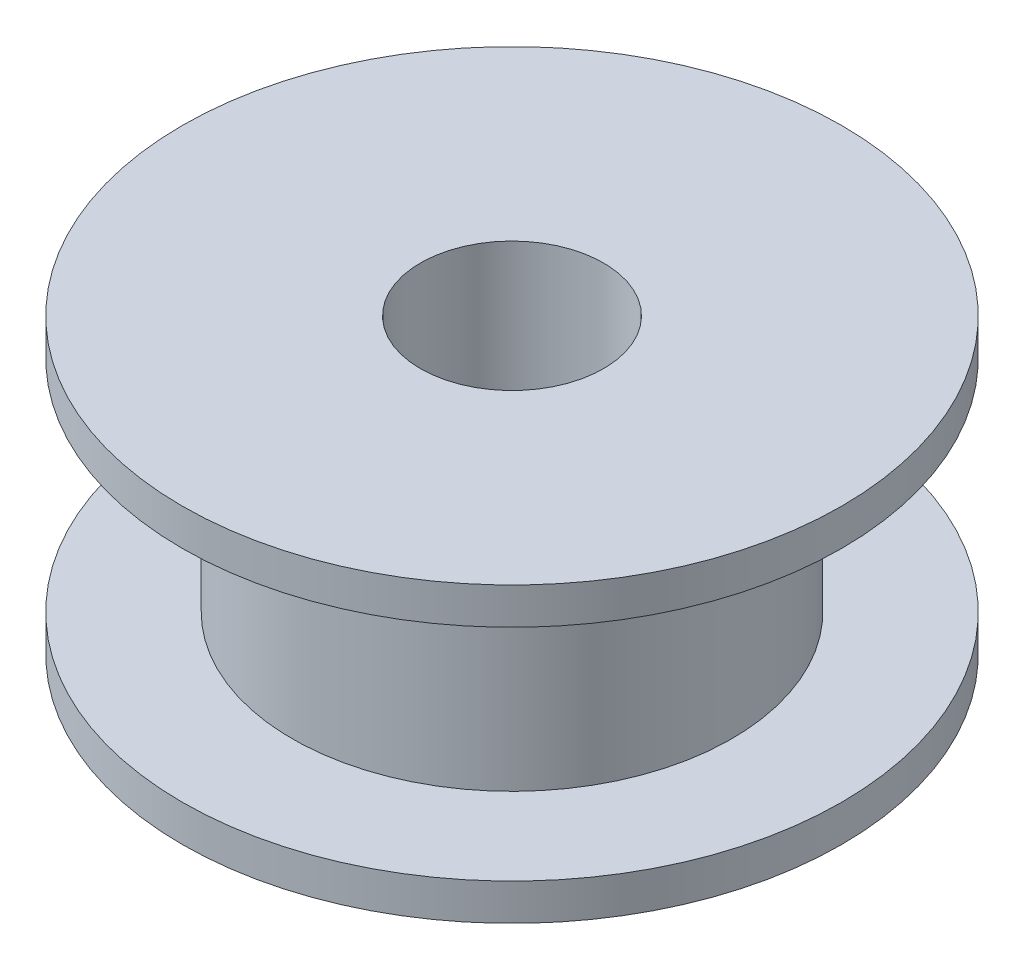
ISO-10303-21;
HEADER;
FILE_DESCRIPTION(('STEP AP214'),'2;1');
FILE_NAME('part.step','',(''),(''),'','','');
FILE_SCHEMA(('AUTOMOTIVE_DESIGN { 1 0 10303 214 1 1 1 1 }'));
ENDSEC;
DATA;
#1=APPLICATION_CONTEXT('core data for automotive mechanical design processes');
#2=APPLICATION_PROTOCOL_DEFINITION('international standard','automotive_design',2000,#1);
#3=PRODUCT_CONTEXT('',#1,'mechanical');
#4=PRODUCT('Part','Part','',(#3));
#5=PRODUCT_RELATED_PRODUCT_CATEGORY('part','',(#4));
#6=PRODUCT_DEFINITION_FORMATION('','',#4);
#7=PRODUCT_DEFINITION_CONTEXT('part definition',#1,'design');
#8=PRODUCT_DEFINITION('design','',#6,#7);
#9=PRODUCT_DEFINITION_SHAPE('','',#8);
#10=(LENGTH_UNIT() NAMED_UNIT(*) SI_UNIT(.MILLI.,.METRE.));
#11=(NAMED_UNIT(*) PLANE_ANGLE_UNIT() SI_UNIT($,.RADIAN.));
#12=(NAMED_UNIT(*) SI_UNIT($,.STERADIAN.) SOLID_ANGLE_UNIT());
#13=UNCERTAINTY_MEASURE_WITH_UNIT(LENGTH_MEASURE(1.E-05),#10,'distance_accuracy_value','');
#14=(GEOMETRIC_REPRESENTATION_CONTEXT(3) GLOBAL_UNCERTAINTY_ASSIGNED_CONTEXT((#13)) GLOBAL_UNIT_ASSIGNED_CONTEXT((#10,
#11,#12)) REPRESENTATION_CONTEXT('',''));
#15=CARTESIAN_POINT('',(0.,0.,0.));
#16=DIRECTION('',(0.,0.,1.));
#17=DIRECTION('',(1.,0.,0.));
#18=AXIS2_PLACEMENT_3D('',#15,#16,#17);
#19=CARTESIAN_POINT('',(0.,8.,0.));
#20=DIRECTION('',(0.,-1.,0.));
#21=DIRECTION('',(0.,0.,-1.));
#22=AXIS2_PLACEMENT_3D('',#19,#20,#21);
#23=CYLINDRICAL_SURFACE('',#22,9.);
#24=CARTESIAN_POINT('',(0.,0.,0.));
#25=DIRECTION('',(0.,1.,0.));
#26=DIRECTION('',(0.,0.,1.));
#27=AXIS2_PLACEMENT_3D('',#24,#25,#26);
#28=CIRCLE('',#27,9.);
#29=CARTESIAN_POINT('',(0.,0.,9.));
#30=VERTEX_POINT('',#29);
#31=EDGE_CURVE('E34',#30,#30,#28,.T.);
#32=ORIENTED_EDGE('',*,*,#31,.T.);
#33=EDGE_LOOP('',(#32));
#34=FACE_BOUND('',#33,.T.);
#35=CARTESIAN_POINT('',(0.,1.,0.));
#36=DIRECTION('',(0.,-1.,0.));
#37=DIRECTION('',(0.,0.,-1.));
#38=AXIS2_PLACEMENT_3D('',#35,#36,#37);
#39=CIRCLE('',#38,9.);
#40=CARTESIAN_POINT('',(0.,1.,-9.));
#41=VERTEX_POINT('',#40);
#42=EDGE_CURVE('E46',#41,#41,#39,.T.);
#43=ORIENTED_EDGE('',*,*,#42,.T.);
#44=EDGE_LOOP('',(#43));
#45=FACE_BOUND('',#44,.T.);
#46=ADVANCED_FACE('F31',(#34,#45),#23,.T.);
#47=CARTESIAN_POINT('',(0.,8.,0.));
#48=DIRECTION('',(0.,1.,0.));
#49=DIRECTION('',(0.,0.,1.));
#50=AXIS2_PLACEMENT_3D('',#47,#48,#49);
#51=CIRCLE('',#50,9.);
#52=CARTESIAN_POINT('',(0.,8.,9.));
#53=VERTEX_POINT('',#52);
#54=EDGE_CURVE('E10',#53,#53,#51,.T.);
#55=ORIENTED_EDGE('',*,*,#54,.F.);
#56=EDGE_LOOP('',(#55));
#57=FACE_BOUND('',#56,.T.);
#58=CARTESIAN_POINT('',(0.,7.,0.));
#59=DIRECTION('',(0.,-1.,0.));
#60=DIRECTION('',(0.,0.,-1.));
#61=AXIS2_PLACEMENT_3D('',#58,#59,#60);
#62=CIRCLE('',#61,9.);
#63=CARTESIAN_POINT('',(0.,7.,-9.));
#64=VERTEX_POINT('',#63);
#65=EDGE_CURVE('E57',#64,#64,#62,.T.);
#66=ORIENTED_EDGE('',*,*,#65,.F.);
#67=EDGE_LOOP('',(#66));
#68=FACE_BOUND('',#67,.T.);
#69=ADVANCED_FACE('F64',(#57,#68),#23,.T.);
#70=CARTESIAN_POINT('',(0.,8.,0.));
#71=DIRECTION('',(0.,1.,0.));
#72=DIRECTION('',(0.,0.,1.));
#73=AXIS2_PLACEMENT_3D('',#70,#71,#72);
#74=PLANE('',#73);
#75=CARTESIAN_POINT('',(0.,8.,0.));
#76=DIRECTION('',(0.,1.,0.));
#77=DIRECTION('',(0.,0.,1.));
#78=AXIS2_PLACEMENT_3D('',#75,#76,#77);
#79=CIRCLE('',#78,2.5);
#80=CARTESIAN_POINT('',(0.,8.,2.5));
#81=VERTEX_POINT('',#80);
#82=EDGE_CURVE('E43',#81,#81,#79,.T.);
#83=ORIENTED_EDGE('',*,*,#82,.F.);
#84=EDGE_LOOP('',(#83));
#85=FACE_BOUND('',#84,.T.);
#86=ORIENTED_EDGE('',*,*,#54,.T.);
#87=EDGE_LOOP('',(#86));
#88=FACE_BOUND('',#87,.T.);
#89=ADVANCED_FACE('F66',(#85,#88),#74,.T.);
#90=CARTESIAN_POINT('',(0.,0.,0.));
#91=DIRECTION('',(0.,1.,0.));
#92=DIRECTION('',(0.,0.,1.));
#93=AXIS2_PLACEMENT_3D('',#90,#91,#92);
#94=PLANE('',#93);
#95=CARTESIAN_POINT('',(0.,0.,0.));
#96=DIRECTION('',(0.,1.,0.));
#97=DIRECTION('',(0.,0.,1.));
#98=AXIS2_PLACEMENT_3D('',#95,#96,#97);
#99=CIRCLE('',#98,2.5);
#100=CARTESIAN_POINT('',(0.,0.,2.5));
#101=VERTEX_POINT('',#100);
#102=EDGE_CURVE('E41',#101,#101,#99,.T.);
#103=ORIENTED_EDGE('',*,*,#102,.T.);
#104=EDGE_LOOP('',(#103));
#105=FACE_BOUND('',#104,.T.);
#106=ORIENTED_EDGE('',*,*,#31,.F.);
#107=EDGE_LOOP('',(#106));
#108=FACE_BOUND('',#107,.T.);
#109=ADVANCED_FACE('F72',(#105,#108),#94,.F.);
#110=CARTESIAN_POINT('',(0.,0.,0.));
#111=DIRECTION('',(0.,1.,0.));
#112=DIRECTION('',(0.,0.,1.));
#113=AXIS2_PLACEMENT_3D('',#110,#111,#112);
#114=CYLINDRICAL_SURFACE('',#113,2.5);
#115=ORIENTED_EDGE('',*,*,#102,.F.);
#116=EDGE_LOOP('',(#115));
#117=FACE_BOUND('',#116,.T.);
#118=ORIENTED_EDGE('',*,*,#82,.T.);
#119=EDGE_LOOP('',(#118));
#120=FACE_BOUND('',#119,.T.);
#121=ADVANCED_FACE('F85',(#117,#120),#114,.F.);
#122=CARTESIAN_POINT('',(0.,1.,9.));
#123=DIRECTION('',(0.,1.,0.));
#124=DIRECTION('',(0.,0.,1.));
#125=AXIS2_PLACEMENT_3D('',#122,#123,#124);
#126=PLANE('',#125);
#127=CARTESIAN_POINT('',(0.,1.,0.));
#128=DIRECTION('',(0.,-1.,0.));
#129=DIRECTION('',(0.,0.,-1.));
#130=AXIS2_PLACEMENT_3D('',#127,#128,#129);
#131=CIRCLE('',#130,6.);
#132=CARTESIAN_POINT('',(0.,1.,-6.));
#133=VERTEX_POINT('',#132);
#134=EDGE_CURVE('E51',#133,#133,#131,.T.);
#135=ORIENTED_EDGE('',*,*,#134,.T.);
#136=EDGE_LOOP('',(#135));
#137=FACE_BOUND('',#136,.T.);
#138=ORIENTED_EDGE('',*,*,#42,.F.);
#139=EDGE_LOOP('',(#138));
#140=FACE_BOUND('',#139,.T.);
#141=ADVANCED_FACE('F82',(#137,#140),#126,.T.);
#142=CARTESIAN_POINT('',(0.,0.,0.));
#143=DIRECTION('',(0.,-1.,0.));
#144=DIRECTION('',(0.,0.,-1.));
#145=AXIS2_PLACEMENT_3D('',#142,#143,#144);
#146=CYLINDRICAL_SURFACE('',#145,6.);
#147=CARTESIAN_POINT('',(0.,7.,0.));
#148=DIRECTION('',(0.,-1.,0.));
#149=DIRECTION('',(0.,0.,-1.));
#150=AXIS2_PLACEMENT_3D('',#147,#148,#149);
#151=CIRCLE('',#150,6.);
#152=CARTESIAN_POINT('',(0.,7.,-6.));
#153=VERTEX_POINT('',#152);
#154=EDGE_CURVE('E54',#153,#153,#151,.T.);
#155=ORIENTED_EDGE('',*,*,#154,.T.);
#156=EDGE_LOOP('',(#155));
#157=FACE_BOUND('',#156,.T.);
#158=ORIENTED_EDGE('',*,*,#134,.F.);
#159=EDGE_LOOP('',(#158));
#160=FACE_BOUND('',#159,.T.);
#161=ADVANCED_FACE('F84',(#157,#160),#146,.T.);
#162=CARTESIAN_POINT('',(0.,7.,9.));
#163=DIRECTION('',(0.,-1.,0.));
#164=DIRECTION('',(0.,0.,-1.));
#165=AXIS2_PLACEMENT_3D('',#162,#163,#164);
#166=PLANE('',#165);
#167=ORIENTED_EDGE('',*,*,#65,.T.);
#168=EDGE_LOOP('',(#167));
#169=FACE_BOUND('',#168,.T.);
#170=ORIENTED_EDGE('',*,*,#154,.F.);
#171=EDGE_LOOP('',(#170));
#172=FACE_BOUND('',#171,.T.);
#173=ADVANCED_FACE('F61',(#169,#172),#166,.T.);
#174=CLOSED_SHELL('',(#46,#69,#89,#109,#121,#141,#161,#173));
#175=MANIFOLD_SOLID_BREP('B2',#174);
#176=ADVANCED_BREP_SHAPE_REPRESENTATION('',(#18,#175),#14);
#177=SHAPE_DEFINITION_REPRESENTATION(#9,#176);
ENDSEC;
END-ISO-10303-21;
